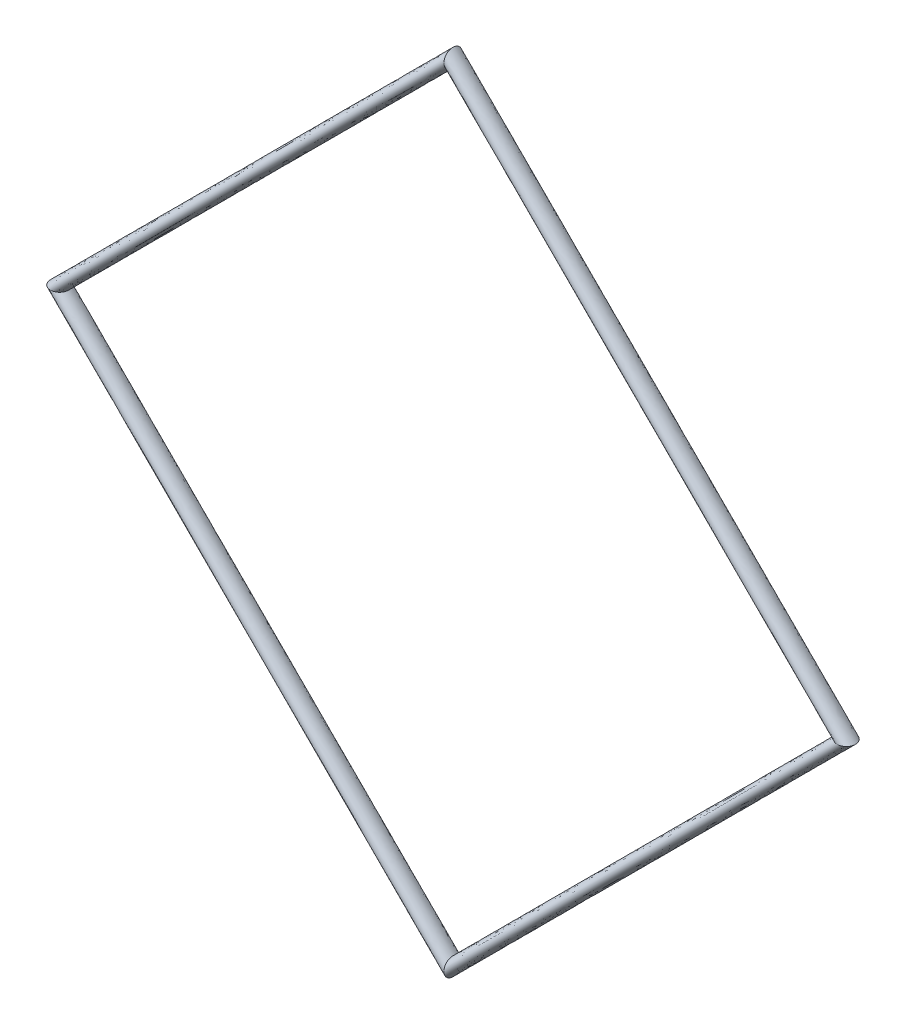
ISO-10303-21;
HEADER;
FILE_DESCRIPTION(('STEP AP214'),'2;1');
FILE_NAME('part.step','',(''),(''),'','','');
FILE_SCHEMA(('AUTOMOTIVE_DESIGN { 1 0 10303 214 1 1 1 1 }'));
ENDSEC;
DATA;
#1=APPLICATION_CONTEXT('core data for automotive mechanical design processes');
#2=APPLICATION_PROTOCOL_DEFINITION('international standard','automotive_design',2000,#1);
#3=PRODUCT_CONTEXT('',#1,'mechanical');
#4=PRODUCT('Part','Part','',(#3));
#5=PRODUCT_RELATED_PRODUCT_CATEGORY('part','',(#4));
#6=PRODUCT_DEFINITION_FORMATION('','',#4);
#7=PRODUCT_DEFINITION_CONTEXT('part definition',#1,'design');
#8=PRODUCT_DEFINITION('design','',#6,#7);
#9=PRODUCT_DEFINITION_SHAPE('','',#8);
#10=(LENGTH_UNIT() NAMED_UNIT(*) SI_UNIT(.MILLI.,.METRE.));
#11=(NAMED_UNIT(*) PLANE_ANGLE_UNIT() SI_UNIT($,.RADIAN.));
#12=(NAMED_UNIT(*) SI_UNIT($,.STERADIAN.) SOLID_ANGLE_UNIT());
#13=UNCERTAINTY_MEASURE_WITH_UNIT(LENGTH_MEASURE(1.E-05),#10,'distance_accuracy_value','');
#14=(GEOMETRIC_REPRESENTATION_CONTEXT(3) GLOBAL_UNCERTAINTY_ASSIGNED_CONTEXT((#13)) GLOBAL_UNIT_ASSIGNED_CONTEXT((#10,
#11,#12)) REPRESENTATION_CONTEXT('',''));
#15=CARTESIAN_POINT('',(0.,0.,0.));
#16=DIRECTION('',(0.,0.,1.));
#17=DIRECTION('',(1.,0.,0.));
#18=AXIS2_PLACEMENT_3D('',#15,#16,#17);
#19=CARTESIAN_POINT('',(-197.565634663521,0.,4.57199999999999));
#20=CARTESIAN_POINT('',(10.1291106781186,-207.69474534164,4.57199999999999));
#21=CARTESIAN_POINT('',(-206.709634663521,0.,4.57199999999999));
#22=CARTESIAN_POINT('',(0.985110678118545,-207.69474534164,4.57199999999999));
#23=CARTESIAN_POINT('',(-206.709634663521,0.,-4.57199999999999));
#24=CARTESIAN_POINT('',(0.985110678118545,-207.69474534164,-4.57199999999999));
#25=CARTESIAN_POINT('',(-197.565634663521,0.,-4.57199999999999));
#26=CARTESIAN_POINT('',(10.1291106781186,-207.69474534164,-4.57199999999999));
#27=CARTESIAN_POINT('',(-188.421634663521,0.,-4.57199999999999));
#28=CARTESIAN_POINT('',(19.2731106781185,-207.69474534164,-4.57199999999999));
#29=CARTESIAN_POINT('',(-188.421634663521,0.,4.57199999999999));
#30=CARTESIAN_POINT('',(19.2731106781185,-207.69474534164,4.57199999999999));
#31=CARTESIAN_POINT('',(-197.565634663521,0.,4.57199999999999));
#32=CARTESIAN_POINT('',(10.1291106781186,-207.69474534164,4.57199999999999));
#33=(BOUNDED_SURFACE() B_SPLINE_SURFACE(3,1,((#19,#20),(#21,#22),(#23,#24),(#25,#26),(#27,#28),
(#29,#30),(#31,#32)),.UNSPECIFIED.,.T.,.F.,.F.) B_SPLINE_SURFACE_WITH_KNOTS((4,3,4),(2,2),(0.,
0.5,1.),(0.,1.),.UNSPECIFIED.) GEOMETRIC_REPRESENTATION_ITEM() RATIONAL_B_SPLINE_SURFACE(((1.,
1.),(0.333333333333333,0.333333333333333),(0.333333333333333,0.333333333333333),(1.,1.),
(0.333333333333333,0.333333333333333),(0.333333333333333,0.333333333333333),(1.,1.))) REPRESENTATION_ITEM('') SURFACE());
#34=CARTESIAN_POINT('',(-197.565634663521,0.,4.57199999999999));
#35=CARTESIAN_POINT('',(-197.308823402851,0.,4.57198861185438));
#36=CARTESIAN_POINT('',(-197.051825929814,0.,4.55028959253432));
#37=CARTESIAN_POINT('',(-196.54490885607,0.,4.46402901782429));
#38=CARTESIAN_POINT('',(-196.294998151838,0.,4.39941587532972));
#39=CARTESIAN_POINT('',(-195.809671885781,0.,4.22916644072681));
#40=CARTESIAN_POINT('',(-195.574249463321,0.,4.12354974090799));
#41=CARTESIAN_POINT('',(-195.12454371449,0.,3.87431817405437));
#42=CARTESIAN_POINT('',(-194.910255149912,0.,3.73071275550514));
#43=CARTESIAN_POINT('',(-194.508802096798,0.,3.40955118564372));
#44=CARTESIAN_POINT('',(-194.321640448895,0.,3.23199148327236));
#45=CARTESIAN_POINT('',(-193.979776494639,0.,2.84796348528349));
#46=CARTESIAN_POINT('',(-193.825075462959,0.,2.64149405496222));
#47=CARTESIAN_POINT('',(-193.552535583954,0.,2.20551732061822));
#48=CARTESIAN_POINT('',(-193.43469605015,0.,1.97601044573125));
#49=CARTESIAN_POINT('',(-193.239220733011,0.,1.50047110153609));
#50=CARTESIAN_POINT('',(-193.161584868834,0.,1.25443866545861));
#51=CARTESIAN_POINT('',(-193.048720231541,0.,0.7528314375672));
#52=CARTESIAN_POINT('',(-193.013491539268,0.,0.49725662756302));
#53=CARTESIAN_POINT('',(-192.986441592481,0.,-0.016179410766656));
#54=CARTESIAN_POINT('',(-192.99462025975,0.,-0.274040634971427));
#55=CARTESIAN_POINT('',(-193.054152690448,0.,-0.784730145031884));
#56=CARTESIAN_POINT('',(-193.105506469988,0.,-1.03755842900951));
#57=CARTESIAN_POINT('',(-193.249931443096,0.,-1.53100517615395));
#58=CARTESIAN_POINT('',(-193.343002680702,0.,-1.77162362643168));
#59=CARTESIAN_POINT('',(-193.568220522987,0.,-2.23381988583276));
#60=CARTESIAN_POINT('',(-193.70036711495,0.,-2.45539770115231));
#61=CARTESIAN_POINT('',(-193.999984361591,0.,-2.87322274874834));
#62=CARTESIAN_POINT('',(-194.167455001971,0.,-3.06946999127775));
#63=CARTESIAN_POINT('',(-194.532966405638,0.,-3.43106314355837));
#64=CARTESIAN_POINT('',(-194.731007173114,0.,-3.59640904907481));
#65=CARTESIAN_POINT('',(-195.152037047459,0.,-3.89150582970298));
#66=CARTESIAN_POINT('',(-195.375026157587,0.,-4.02125670016302));
#67=CARTESIAN_POINT('',(-195.839622680133,0.,-4.24148013109416));
#68=CARTESIAN_POINT('',(-196.081230091753,0.,-4.33195269324699));
#69=CARTESIAN_POINT('',(-196.576204690132,0.,-4.47105126240243));
#70=CARTESIAN_POINT('',(-196.829571876361,0.,-4.51967727129026));
#71=CARTESIAN_POINT('',(-197.340873684917,0.,-4.5737023914721));
#72=CARTESIAN_POINT('',(-197.598808307244,0.,-4.57910150276611));
#73=CARTESIAN_POINT('',(-198.111922994352,0.,-4.54651956212838));
#74=CARTESIAN_POINT('',(-198.367103059008,0.,-4.50853850824232));
#75=CARTESIAN_POINT('',(-198.867464817605,0.,-4.39027440199325));
#76=CARTESIAN_POINT('',(-199.112646511117,0.,-4.30999134781904));
#77=CARTESIAN_POINT('',(-199.586051496469,0.,-4.10940225322151));
#78=CARTESIAN_POINT('',(-199.814274790525,0.,-3.98909621802854));
#79=CARTESIAN_POINT('',(-200.24728439519,0.,-3.71187631207898));
#80=CARTESIAN_POINT('',(-200.452070709011,0.,-3.55496244633919));
#81=CARTESIAN_POINT('',(-200.832393187623,0.,-3.20898112148864));
#82=CARTESIAN_POINT('',(-201.007929340575,0.,-3.0199136493632));
#83=CARTESIAN_POINT('',(-201.32476849093,0.,-2.61499216130598));
#84=CARTESIAN_POINT('',(-201.466071477192,0.,-2.3991381366573));
#85=CARTESIAN_POINT('',(-201.710432909948,0.,-1.94677129955894));
#86=CARTESIAN_POINT('',(-201.813491396813,0.,-1.71025850891709));
#87=CARTESIAN_POINT('',(-201.97843848717,0.,-1.22328793139402));
#88=CARTESIAN_POINT('',(-202.040327106025,0.,-0.972830149716376));
#89=CARTESIAN_POINT('',(-202.121177758557,0.,-0.46507879613651));
#90=CARTESIAN_POINT('',(-202.140139714883,0.,-0.207785211917673));
#91=CARTESIAN_POINT('',(-202.134598556385,0.,0.306332997239181));
#92=CARTESIAN_POINT('',(-202.11009552442,0.,0.563157623070265));
#93=CARTESIAN_POINT('',(-202.018319981944,0.,1.0690484386535));
#94=CARTESIAN_POINT('',(-201.951047385431,0.,1.31811461280386));
#95=CARTESIAN_POINT('',(-201.775640835647,0.,1.8014222175758));
#96=CARTESIAN_POINT('',(-201.667506121371,0.,2.03566337200547));
#97=CARTESIAN_POINT('',(-201.413449539634,0.,2.48265746562916));
#98=CARTESIAN_POINT('',(-201.267529155839,0.,2.69541124807574));
#99=CARTESIAN_POINT('',(-200.942060853246,0.,3.09338070898616));
#100=CARTESIAN_POINT('',(-200.76251645449,0.,3.27859926642845));
#101=CARTESIAN_POINT('',(-200.374828298527,0.,3.61631146368265));
#102=CARTESIAN_POINT('',(-200.166677444142,0.,3.76879695838924));
#103=CARTESIAN_POINT('',(-199.727648837001,0.,4.03671548447496));
#104=CARTESIAN_POINT('',(-199.496760280507,0.,4.15213079001559));
#105=CARTESIAN_POINT('',(-199.019064764256,0.,4.34242740100954));
#106=CARTESIAN_POINT('',(-198.772277285736,1.59126455402273E-13,4.41735729512448));
#107=CARTESIAN_POINT('',(-198.364203294503,1.03328632963321E-13,4.50458560720421));
#108=CARTESIAN_POINT('',(-198.20556835542,0.,4.52983445406876));
#109=CARTESIAN_POINT('',(-197.886524737388,0.,4.56354520869359));
#110=CARTESIAN_POINT('',(-197.726116058437,0.,4.57200711645387));
#111=CARTESIAN_POINT('',(-197.565634663521,0.,4.57199999999999));
#112=B_SPLINE_CURVE_WITH_KNOTS('',3,(#34,#35,#36,#37,#38,#39,#40,#41,#42,#43,#44,#45,#46,#47,
#48,#49,#50,#51,#52,#53,#54,#55,#56,#57,#58,#59,#60,#61,#62,#63,#64,#65,#66,#67,#68,#69,#70,#71,
#72,#73,#74,#75,#76,#77,#78,#79,#80,#81,#82,#83,#84,#85,#86,#87,#88,#89,#90,#91,#92,#93,#94,#95,
#96,#97,#98,#99,#100,#101,#102,#103,#104,#105,#106,#107,#108,#109,#110,#111),.UNSPECIFIED.,.T.,
.F.,(4,2,2,2,2,2,2,2,2,2,2,2,2,2,2,2,2,2,2,2,2,2,2,2,2,2,2,2,2,2,2,2,2,2,2,2,2,2,4),(0.,
0.769848025256944,1.54062316452426,2.31103046496558,3.08124633095741,3.85154279294848,
4.6218694974735,5.39218185520754,6.16249266399161,6.93280494126339,7.70311583050972,
8.47342700719498,9.24373899702788,10.0140507361851,10.784362163546,11.5546736964717,
12.3249853300641,13.0952969306749,13.8656084965823,14.6359200624898,15.4062316631005,
16.176543296693,16.9468548296187,17.7171662569797,18.4874779961368,19.2577899859697,
20.0281011626549,20.7984120519013,21.5687243291731,22.3390351379572,23.1093474956912,
23.8796742002162,24.6499706622073,25.4201865281991,26.1905938286404,26.9613689679077,
27.7312169931646,28.2122951384283,28.6933732836921),.UNSPECIFIED.);
#113=CARTESIAN_POINT('',(-197.565634663521,0.,4.57199999999999));
#114=VERTEX_POINT('',#113);
#115=EDGE_CURVE('E69',#114,#114,#112,.T.);
#116=CARTESIAN_POINT('',(0.,-197.565634663521,0.));
#117=DIRECTION('',(1.,0.,0.));
#118=DIRECTION('',(0.,0.,1.));
#119=AXIS2_PLACEMENT_3D('',#116,#117,#118);
#120=CIRCLE('',#119,4.57199999999999);
#121=CARTESIAN_POINT('',(0.,-197.565634663521,4.57199999999999));
#122=VERTEX_POINT('',#121);
#123=EDGE_CURVE('E41',#122,#122,#120,.T.);
#124=ORIENTED_EDGE('',*,*,#115,.F.);
#125=EDGE_LOOP('',(#124));
#126=FACE_BOUND('',#125,.T.);
#127=ORIENTED_EDGE('',*,*,#123,.F.);
#128=EDGE_LOOP('',(#127));
#129=FACE_BOUND('',#128,.T.);
#130=ADVANCED_FACE('F36',(#126,#129),#33,.T.);
#131=CARTESIAN_POINT('',(0.,-197.565634663521,4.57199999999999));
#132=CARTESIAN_POINT('',(207.69474534164,10.1291106781187,4.57199999999999));
#133=CARTESIAN_POINT('',(0.,-206.709634663521,4.57199999999999));
#134=CARTESIAN_POINT('',(207.69474534164,0.985110678118669,4.57199999999999));
#135=CARTESIAN_POINT('',(0.,-206.709634663521,-4.57199999999999));
#136=CARTESIAN_POINT('',(207.69474534164,0.985110678118669,-4.57199999999999));
#137=CARTESIAN_POINT('',(0.,-197.565634663521,-4.57199999999999));
#138=CARTESIAN_POINT('',(207.69474534164,10.1291106781187,-4.57199999999999));
#139=CARTESIAN_POINT('',(0.,-188.421634663521,-4.57199999999999));
#140=CARTESIAN_POINT('',(207.69474534164,19.2731106781186,-4.57199999999999));
#141=CARTESIAN_POINT('',(0.,-188.421634663521,4.57199999999999));
#142=CARTESIAN_POINT('',(207.69474534164,19.2731106781186,4.57199999999999));
#143=CARTESIAN_POINT('',(0.,-197.565634663521,4.57199999999999));
#144=CARTESIAN_POINT('',(207.69474534164,10.1291106781187,4.57199999999999));
#145=(BOUNDED_SURFACE() B_SPLINE_SURFACE(3,1,((#131,#132),(#133,#134),(#135,#136),(#137,#138),
(#139,#140),(#141,#142),(#143,#144)),.UNSPECIFIED.,.T.,.F.,.F.) B_SPLINE_SURFACE_WITH_KNOTS((4,
3,4),(2,2),(0.,0.5,1.),(0.,1.),
.UNSPECIFIED.) GEOMETRIC_REPRESENTATION_ITEM() RATIONAL_B_SPLINE_SURFACE(((1.,1.),
(0.333333333333333,0.333333333333333),(0.333333333333333,0.333333333333333),(1.,1.),
(0.333333333333333,0.333333333333333),(0.333333333333333,0.333333333333333),(1.,1.))) REPRESENTATION_ITEM('') SURFACE());
#146=CARTESIAN_POINT('',(197.565634663521,0.,0.));
#147=DIRECTION('',(0.,1.,0.));
#148=DIRECTION('',(0.,0.,1.));
#149=AXIS2_PLACEMENT_3D('',#146,#147,#148);
#150=CIRCLE('',#149,4.57199999999999);
#151=CARTESIAN_POINT('',(197.565634663521,0.,4.57199999999999));
#152=VERTEX_POINT('',#151);
#153=EDGE_CURVE('E152',#152,#152,#150,.T.);
#154=ORIENTED_EDGE('',*,*,#123,.T.);
#155=EDGE_LOOP('',(#154));
#156=FACE_BOUND('',#155,.T.);
#157=ORIENTED_EDGE('',*,*,#153,.F.);
#158=EDGE_LOOP('',(#157));
#159=FACE_BOUND('',#158,.T.);
#160=ADVANCED_FACE('F162',(#156,#159),#145,.T.);
#161=CARTESIAN_POINT('',(0.,197.565634663521,4.57199999999999));
#162=CARTESIAN_POINT('',(-207.69474534164,-10.1291106781187,4.57199999999999));
#163=CARTESIAN_POINT('',(0.,206.709634663521,4.57199999999999));
#164=CARTESIAN_POINT('',(-207.69474534164,-0.985110678118669,4.57199999999999));
#165=CARTESIAN_POINT('',(0.,206.709634663521,-4.57199999999999));
#166=CARTESIAN_POINT('',(-207.69474534164,-0.985110678118669,-4.57199999999999));
#167=CARTESIAN_POINT('',(0.,197.565634663521,-4.57199999999999));
#168=CARTESIAN_POINT('',(-207.69474534164,-10.1291106781187,-4.57199999999999));
#169=CARTESIAN_POINT('',(0.,188.421634663521,-4.57199999999999));
#170=CARTESIAN_POINT('',(-207.69474534164,-19.2731106781186,-4.57199999999999));
#171=CARTESIAN_POINT('',(0.,188.421634663521,4.57199999999999));
#172=CARTESIAN_POINT('',(-207.69474534164,-19.2731106781186,4.57199999999999));
#173=CARTESIAN_POINT('',(0.,197.565634663521,4.57199999999999));
#174=CARTESIAN_POINT('',(-207.69474534164,-10.1291106781187,4.57199999999999));
#175=(BOUNDED_SURFACE() B_SPLINE_SURFACE(3,1,((#161,#162),(#163,#164),(#165,#166),(#167,#168),
(#169,#170),(#171,#172),(#173,#174)),.UNSPECIFIED.,.T.,.F.,.F.) B_SPLINE_SURFACE_WITH_KNOTS((4,
3,4),(2,2),(0.,0.5,1.),(0.,1.),
.UNSPECIFIED.) GEOMETRIC_REPRESENTATION_ITEM() RATIONAL_B_SPLINE_SURFACE(((1.,1.),
(0.333333333333333,0.333333333333333),(0.333333333333333,0.333333333333333),(1.,1.),
(0.333333333333333,0.333333333333333),(0.333333333333333,0.333333333333333),(1.,1.))) REPRESENTATION_ITEM('') SURFACE());
#176=CARTESIAN_POINT('',(0.,197.565634663521,4.57199999999999));
#177=CARTESIAN_POINT('',(0.,197.308823402851,4.57198861185439));
#178=CARTESIAN_POINT('',(0.,197.051825929814,4.55028959253432));
#179=CARTESIAN_POINT('',(0.,196.54490885607,4.46402901782429));
#180=CARTESIAN_POINT('',(0.,196.294998151838,4.39941587532971));
#181=CARTESIAN_POINT('',(0.,195.80967188578,4.22916644072678));
#182=CARTESIAN_POINT('',(0.,195.574249463321,4.12354974090796));
#183=CARTESIAN_POINT('',(0.,195.12454371449,3.87431817405434));
#184=CARTESIAN_POINT('',(0.,194.910255149912,3.73071275550512));
#185=CARTESIAN_POINT('',(0.,194.508802096798,3.40955118564368));
#186=CARTESIAN_POINT('',(0.,194.321640448895,3.2319914832723));
#187=CARTESIAN_POINT('',(0.,193.979776494639,2.84796348528341));
#188=CARTESIAN_POINT('',(0.,193.825075462959,2.64149405496216));
#189=CARTESIAN_POINT('',(0.,193.552535583954,2.20551732061816));
#190=CARTESIAN_POINT('',(0.,193.43469605015,1.97601044573118));
#191=CARTESIAN_POINT('',(0.,193.239220733011,1.50047110153602));
#192=CARTESIAN_POINT('',(0.,193.161584868834,1.25443866545855));
#193=CARTESIAN_POINT('',(0.,193.048720231541,0.752831437567148));
#194=CARTESIAN_POINT('',(0.,193.013491539268,0.497256627562961));
#195=CARTESIAN_POINT('',(0.,192.986441592481,-0.0161794107667197));
#196=CARTESIAN_POINT('',(0.,192.99462025975,-0.274040634971487));
#197=CARTESIAN_POINT('',(0.,193.054152690448,-0.784730145031953));
#198=CARTESIAN_POINT('',(0.,193.105506469988,-1.03755842900959));
#199=CARTESIAN_POINT('',(0.,193.249931443096,-1.53100517615403));
#200=CARTESIAN_POINT('',(0.,193.343002680702,-1.77162362643175));
#201=CARTESIAN_POINT('',(0.,193.568220522987,-2.2338198858328));
#202=CARTESIAN_POINT('',(0.,193.70036711495,-2.45539770115234));
#203=CARTESIAN_POINT('',(0.,193.999984361591,-2.87322274874838));
#204=CARTESIAN_POINT('',(0.,194.167455001971,-3.06946999127781));
#205=CARTESIAN_POINT('',(0.,194.532966405638,-3.43106314355844));
#206=CARTESIAN_POINT('',(0.,194.731007173114,-3.59640904907486));
#207=CARTESIAN_POINT('',(0.,195.152037047459,-3.891505829703));
#208=CARTESIAN_POINT('',(0.,195.375026157587,-4.02125670016305));
#209=CARTESIAN_POINT('',(0.,195.839622680133,-4.24148013109419));
#210=CARTESIAN_POINT('',(0.,196.081230091753,-4.33195269324702));
#211=CARTESIAN_POINT('',(0.,196.576204690132,-4.47105126240246));
#212=CARTESIAN_POINT('',(0.,196.829571876361,-4.51967727129028));
#213=CARTESIAN_POINT('',(0.,197.340873684917,-4.57370239147211));
#214=CARTESIAN_POINT('',(0.,197.598808307244,-4.5791015027661));
#215=CARTESIAN_POINT('',(0.,198.111922994352,-4.54651956212837));
#216=CARTESIAN_POINT('',(0.,198.367103059008,-4.50853850824233));
#217=CARTESIAN_POINT('',(0.,198.867464817605,-4.39027440199326));
#218=CARTESIAN_POINT('',(0.,199.112646511117,-4.30999134781904));
#219=CARTESIAN_POINT('',(0.,199.586051496469,-4.10940225322147));
#220=CARTESIAN_POINT('',(0.,199.814274790525,-3.98909621802846));
#221=CARTESIAN_POINT('',(0.,200.24728439519,-3.71187631207891));
#222=CARTESIAN_POINT('',(0.,200.452070709011,-3.55496244633916));
#223=CARTESIAN_POINT('',(0.,200.832393187623,-3.20898112148866));
#224=CARTESIAN_POINT('',(0.,201.007929340575,-3.01991364936324));
#225=CARTESIAN_POINT('',(0.,201.32476849093,-2.61499216130601));
#226=CARTESIAN_POINT('',(0.,201.466071477192,-2.3991381366573));
#227=CARTESIAN_POINT('',(0.,201.710432909948,-1.9467712995589));
#228=CARTESIAN_POINT('',(0.,201.813491396813,-1.71025850891702));
#229=CARTESIAN_POINT('',(0.,201.97843848717,-1.22328793139394));
#230=CARTESIAN_POINT('',(0.,202.040327106025,-0.972830149716283));
#231=CARTESIAN_POINT('',(0.,202.121177758557,-0.465078796136427));
#232=CARTESIAN_POINT('',(0.,202.140139714883,-0.207785211917606));
#233=CARTESIAN_POINT('',(0.,202.134598556385,0.306332997239242));
#234=CARTESIAN_POINT('',(0.,202.11009552442,0.563157623070337));
#235=CARTESIAN_POINT('',(0.,202.018319981944,1.06904843865358));
#236=CARTESIAN_POINT('',(0.,201.951047385431,1.31811461280394));
#237=CARTESIAN_POINT('',(0.,201.775640835647,1.80142221757587));
#238=CARTESIAN_POINT('',(0.,201.667506121371,2.03566337200553));
#239=CARTESIAN_POINT('',(0.,201.413449539634,2.4826574656292));
#240=CARTESIAN_POINT('',(0.,201.267529155839,2.69541124807578));
#241=CARTESIAN_POINT('',(0.,200.942060853246,3.09338070898623));
#242=CARTESIAN_POINT('',(0.,200.76251645449,3.27859926642854));
#243=CARTESIAN_POINT('',(0.,200.374828298527,3.61631146368273));
#244=CARTESIAN_POINT('',(0.,200.166677444142,3.76879695838927));
#245=CARTESIAN_POINT('',(0.,199.727648837001,4.03671548447496));
#246=CARTESIAN_POINT('',(0.,199.496760280507,4.1521307900156));
#247=CARTESIAN_POINT('',(0.,199.019064764256,4.34242740100956));
#248=CARTESIAN_POINT('',(1.55852489782016E-13,198.772277285735,4.41735729512451));
#249=CARTESIAN_POINT('',(1.07078457074383E-13,198.364203294503,4.50458560720423));
#250=CARTESIAN_POINT('',(0.,198.20556835542,4.52983445406877));
#251=CARTESIAN_POINT('',(0.,197.886524737388,4.56354520869359));
#252=CARTESIAN_POINT('',(0.,197.726116058437,4.57200711645387));
#253=CARTESIAN_POINT('',(0.,197.565634663521,4.57199999999999));
#254=B_SPLINE_CURVE_WITH_KNOTS('',3,(#176,#177,#178,#179,#180,#181,#182,#183,#184,#185,#186,
#187,#188,#189,#190,#191,#192,#193,#194,#195,#196,#197,#198,#199,#200,#201,#202,#203,#204,#205,
#206,#207,#208,#209,#210,#211,#212,#213,#214,#215,#216,#217,#218,#219,#220,#221,#222,#223,#224,
#225,#226,#227,#228,#229,#230,#231,#232,#233,#234,#235,#236,#237,#238,#239,#240,#241,#242,#243,
#244,#245,#246,#247,#248,#249,#250,#251,#252,#253),.UNSPECIFIED.,.T.,.F.,(4,2,2,2,2,2,2,2,2,2,2,
2,2,2,2,2,2,2,2,2,2,2,2,2,2,2,2,2,2,2,2,2,2,2,2,2,2,2,4),(0.,0.769848025256943,1.54062316452433,
2.31103046496564,3.08124633095745,3.85154279294855,4.6218694974736,5.39218185520762,
6.16249266399169,6.93280494126347,7.70311583050981,8.47342700719507,9.24373899702795,
10.0140507361851,10.7843621635461,11.5546736964718,12.3249853300642,13.0952969306749,
13.8656084965824,14.6359200624898,15.4062316631005,16.176543296693,16.9468548296188,
17.7171662569797,18.4874779961368,19.2577899859697,20.028101162655,20.7984120519014,
21.5687243291732,22.3390351379572,23.1093474956913,23.8796742002163,24.6499706622073,
25.4201865281992,26.1905938286405,26.9613689679078,27.7312169931647,28.2122951384284,
28.6933732836921),.UNSPECIFIED.);
#255=CARTESIAN_POINT('',(0.,197.565634663521,4.57199999999999));
#256=VERTEX_POINT('',#255);
#257=EDGE_CURVE('E147',#256,#256,#254,.T.);
#258=ORIENTED_EDGE('',*,*,#257,.F.);
#259=EDGE_LOOP('',(#258));
#260=FACE_BOUND('',#259,.T.);
#261=ORIENTED_EDGE('',*,*,#115,.T.);
#262=EDGE_LOOP('',(#261));
#263=FACE_BOUND('',#262,.T.);
#264=ADVANCED_FACE('F156',(#260,#263),#175,.T.);
#265=CARTESIAN_POINT('',(197.565634663521,0.,4.57199999999999));
#266=CARTESIAN_POINT('',(-10.1291106781187,207.69474534164,4.57199999999999));
#267=CARTESIAN_POINT('',(206.709634663521,0.,4.57199999999999));
#268=CARTESIAN_POINT('',(-0.985110678118669,207.69474534164,4.57199999999999));
#269=CARTESIAN_POINT('',(206.709634663521,0.,-4.57199999999999));
#270=CARTESIAN_POINT('',(-0.985110678118669,207.69474534164,-4.57199999999999));
#271=CARTESIAN_POINT('',(197.565634663521,0.,-4.57199999999999));
#272=CARTESIAN_POINT('',(-10.1291106781187,207.69474534164,-4.57199999999999));
#273=CARTESIAN_POINT('',(188.421634663521,0.,-4.57199999999999));
#274=CARTESIAN_POINT('',(-19.2731106781186,207.69474534164,-4.57199999999999));
#275=CARTESIAN_POINT('',(188.421634663521,0.,4.57199999999999));
#276=CARTESIAN_POINT('',(-19.2731106781186,207.69474534164,4.57199999999999));
#277=CARTESIAN_POINT('',(197.565634663521,0.,4.57199999999999));
#278=CARTESIAN_POINT('',(-10.1291106781187,207.69474534164,4.57199999999999));
#279=(BOUNDED_SURFACE() B_SPLINE_SURFACE(3,1,((#265,#266),(#267,#268),(#269,#270),(#271,#272),
(#273,#274),(#275,#276),(#277,#278)),.UNSPECIFIED.,.T.,.F.,.F.) B_SPLINE_SURFACE_WITH_KNOTS((4,
3,4),(2,2),(0.,0.5,1.),(0.,1.),
.UNSPECIFIED.) GEOMETRIC_REPRESENTATION_ITEM() RATIONAL_B_SPLINE_SURFACE(((1.,1.),
(0.333333333333333,0.333333333333333),(0.333333333333333,0.333333333333333),(1.,1.),
(0.333333333333333,0.333333333333333),(0.333333333333333,0.333333333333333),(1.,1.))) REPRESENTATION_ITEM('') SURFACE());
#280=ORIENTED_EDGE('',*,*,#153,.T.);
#281=EDGE_LOOP('',(#280));
#282=FACE_BOUND('',#281,.T.);
#283=ORIENTED_EDGE('',*,*,#257,.T.);
#284=EDGE_LOOP('',(#283));
#285=FACE_BOUND('',#284,.T.);
#286=ADVANCED_FACE('F141',(#282,#285),#279,.T.);
#287=CLOSED_SHELL('',(#130,#160,#264,#286));
#288=CARTESIAN_POINT('',(-197.565634663521,0.,4.31799999999999));
#289=CARTESIAN_POINT('',(9.57031067811856,-207.13594534164,4.31799999999999));
#290=CARTESIAN_POINT('',(-188.929634663521,0.,4.31799999999999));
#291=CARTESIAN_POINT('',(18.2063106781186,-207.13594534164,4.31799999999999));
#292=CARTESIAN_POINT('',(-188.929634663521,0.,-4.31799999999999));
#293=CARTESIAN_POINT('',(18.2063106781186,-207.13594534164,-4.31799999999999));
#294=CARTESIAN_POINT('',(-197.565634663521,0.,-4.31799999999999));
#295=CARTESIAN_POINT('',(9.57031067811856,-207.13594534164,-4.31799999999999));
#296=CARTESIAN_POINT('',(-206.201634663521,0.,-4.31799999999999));
#297=CARTESIAN_POINT('',(0.934310678118597,-207.13594534164,-4.31799999999999));
#298=CARTESIAN_POINT('',(-206.201634663521,0.,4.31799999999999));
#299=CARTESIAN_POINT('',(0.934310678118597,-207.13594534164,4.31799999999999));
#300=CARTESIAN_POINT('',(-197.565634663521,0.,4.31799999999999));
#301=CARTESIAN_POINT('',(9.57031067811856,-207.13594534164,4.31799999999999));
#302=(BOUNDED_SURFACE() B_SPLINE_SURFACE(3,1,((#288,#289),(#290,#291),(#292,#293),(#294,#295),
(#296,#297),(#298,#299),(#300,#301)),.UNSPECIFIED.,.T.,.F.,.F.) B_SPLINE_SURFACE_WITH_KNOTS((4,
3,4),(2,2),(0.,0.5,1.),(0.,1.),
.UNSPECIFIED.) GEOMETRIC_REPRESENTATION_ITEM() RATIONAL_B_SPLINE_SURFACE(((1.,1.),
(0.333333333333333,0.333333333333333),(0.333333333333333,0.333333333333333),(1.,1.),
(0.333333333333333,0.333333333333333),(0.333333333333333,0.333333333333333),(1.,1.))) REPRESENTATION_ITEM('') SURFACE());
#303=CARTESIAN_POINT('',(-197.565634663521,0.,4.31799999999999));
#304=CARTESIAN_POINT('',(-197.808178631933,0.,4.31798924452914));
#305=CARTESIAN_POINT('',(-198.050898467578,0.,4.29749572628241));
#306=CARTESIAN_POINT('',(-198.52965348167,0.,4.21602740572295));
#307=CARTESIAN_POINT('',(-198.765680257889,0.,4.15500388225585));
#308=CARTESIAN_POINT('',(-199.22404395361,0.,3.99421274957532));
#309=CARTESIAN_POINT('',(-199.446387352599,0.,3.89446364419087));
#310=CARTESIAN_POINT('',(-199.871109448717,0.,3.65907827549578));
#311=CARTESIAN_POINT('',(-200.073493093042,0.,3.52345093575483));
#312=CARTESIAN_POINT('',(-200.45264319876,0.,3.22013167533015));
#313=CARTESIAN_POINT('',(-200.629406977335,0.,3.0524364008683));
#314=CARTESIAN_POINT('',(-200.952278489688,0.,2.6897432916566));
#315=CARTESIAN_POINT('',(-201.098385019608,0.,2.49474438524209));
#316=CARTESIAN_POINT('',(-201.355783794224,0.,2.08298858058389));
#317=CARTESIAN_POINT('',(-201.467076687261,0.,1.86623208763508));
#318=CARTESIAN_POINT('',(-201.651692264559,0.,1.41711159589518));
#319=CARTESIAN_POINT('',(-201.725015025171,0.,1.18474762848866));
#320=CARTESIAN_POINT('',(-201.831609404836,0.,0.711007468813428));
#321=CARTESIAN_POINT('',(-201.864880947538,0.,0.469631259365036));
#322=CARTESIAN_POINT('',(-201.890428119504,0.,-0.0152805546129855));
#323=CARTESIAN_POINT('',(-201.882703822639,0.,-0.258816155250818));
#324=CARTESIAN_POINT('',(-201.826478749202,0.,-0.741134025863487));
#325=CARTESIAN_POINT('',(-201.777977957414,0.,-0.979916294064599));
#326=CARTESIAN_POINT('',(-201.641576593923,0.,-1.44594933303435));
#327=CARTESIAN_POINT('',(-201.553675980628,0.,-1.67320009162997));
#328=CARTESIAN_POINT('',(-201.340970240693,0.,-2.10971878106431));
#329=CARTESIAN_POINT('',(-201.216165126061,0.,-2.31898671775499));
#330=CARTESIAN_POINT('',(-200.933193282011,0.,-2.71359926270682));
#331=CARTESIAN_POINT('',(-200.775026566097,0.,-2.89894388065128));
#332=CARTESIAN_POINT('',(-200.429821351523,0.,-3.24044852447186));
#333=CARTESIAN_POINT('',(-200.242782848906,0.,-3.39660854634846));
#334=CARTESIAN_POINT('',(-199.845143523136,0.,-3.67531106138613));
#335=CARTESIAN_POINT('',(-199.634542696904,0.,-3.79785355015396));
#336=CARTESIAN_POINT('',(-199.195757092277,0.,-4.00584234603339));
#337=CARTESIAN_POINT('',(-198.967572314636,0.,-4.0912886547333));
#338=CARTESIAN_POINT('',(-198.500096305056,0.,-4.22265952560233));
#339=CARTESIAN_POINT('',(-198.260805073618,0.,-4.26858408955193));
#340=CARTESIAN_POINT('',(-197.777908921092,0.,-4.31960781416809));
#341=CARTESIAN_POINT('',(-197.534304000005,0.,-4.32470697483465));
#342=CARTESIAN_POINT('',(-197.049695684403,0.,-4.29393514201012));
#343=CARTESIAN_POINT('',(-196.808692290006,0.,-4.25806414667329));
#344=CARTESIAN_POINT('',(-196.336128406887,0.,-4.14637026854916));
#345=CARTESIAN_POINT('',(-196.10456791857,0.,-4.07054738405127));
#346=CARTESIAN_POINT('',(-195.657463210182,0.,-3.88110212804247));
#347=CARTESIAN_POINT('',(-195.441918988018,0.,-3.76747976147133));
#348=CARTESIAN_POINT('',(-195.032965472501,0.,-3.50566096140784));
#349=CARTESIAN_POINT('',(-194.839556176115,0.,-3.3574645326536));
#350=CARTESIAN_POINT('',(-194.480362724092,0.,-3.03070439251699));
#351=CARTESIAN_POINT('',(-194.314578579637,0.,-2.852140668843));
#352=CARTESIAN_POINT('',(-194.015341604302,0.,-2.46971481901118));
#353=CARTESIAN_POINT('',(-193.881888783944,0.,-2.26585268462074));
#354=CARTESIAN_POINT('',(-193.651102986341,0.,-1.83861733847226));
#355=CARTESIAN_POINT('',(-193.553769970969,0.,-1.6152441473105));
#356=CARTESIAN_POINT('',(-193.397986607853,0.,-1.15532749076094));
#357=CARTESIAN_POINT('',(-193.339536245601,0.,-0.918784030287618));
#358=CARTESIAN_POINT('',(-193.263177295988,0.,-0.439241085239982));
#359=CARTESIAN_POINT('',(-193.24526878168,0.,-0.196241589033312));
#360=CARTESIAN_POINT('',(-193.250502098039,0.,0.289314497392596));
#361=CARTESIAN_POINT('',(-193.27364385045,0.,0.531871088455285));
#362=CARTESIAN_POINT('',(-193.360320751678,0.,1.00965685872834));
#363=CARTESIAN_POINT('',(-193.423855981718,0.,1.24488602320368));
#364=CARTESIAN_POINT('',(-193.58951772318,0.,1.70134320548829));
#365=CARTESIAN_POINT('',(-193.69164495333,0.,1.92257096244964));
#366=CARTESIAN_POINT('',(-193.931587280526,0.,2.344732050872));
#367=CARTESIAN_POINT('',(-194.069400976333,0.,2.5456661787382));
#368=CARTESIAN_POINT('',(-194.376787706559,0.,2.92152622515362));
#369=CARTESIAN_POINT('',(-194.546357416496,0.,3.09645486273803));
#370=CARTESIAN_POINT('',(-194.912507341572,0.,3.41540527125588));
#371=CARTESIAN_POINT('',(-195.109094259602,0.,3.55941934958985));
#372=CARTESIAN_POINT('',(-195.523732388569,0.,3.81245351311522));
#373=CARTESIAN_POINT('',(-195.741793803035,0.,3.92145685723693));
#374=CARTESIAN_POINT('',(-196.192950679494,0.,4.10118143428679));
#375=CARTESIAN_POINT('',(-196.426027742541,-1.44765860456312E-13,4.17194855650646));
#376=CARTESIAN_POINT('',(-196.811430956484,-1.03782958332038E-13,4.25433085124843));
#377=CARTESIAN_POINT('',(-196.961252843395,0.,4.27817698439828));
#378=CARTESIAN_POINT('',(-197.262571815981,0.,4.31001491932172));
#379=CARTESIAN_POINT('',(-197.414068901656,0.,4.31800672109532));
#380=CARTESIAN_POINT('',(-197.565634663521,0.,4.31799999999999));
#381=B_SPLINE_CURVE_WITH_KNOTS('',3,(#303,#304,#305,#306,#307,#308,#309,#310,#311,#312,#313,
#314,#315,#316,#317,#318,#319,#320,#321,#322,#323,#324,#325,#326,#327,#328,#329,#330,#331,#332,
#333,#334,#335,#336,#337,#338,#339,#340,#341,#342,#343,#344,#345,#346,#347,#348,#349,#350,#351,
#352,#353,#354,#355,#356,#357,#358,#359,#360,#361,#362,#363,#364,#365,#366,#367,#368,#369,#370,
#371,#372,#373,#374,#375,#376,#377,#378,#379,#380),.UNSPECIFIED.,.T.,.F.,(4,2,2,2,2,2,2,2,2,2,2,
2,2,2,2,2,2,2,2,2,2,2,2,2,2,2,2,2,2,2,2,2,2,2,2,2,2,2,4),(0.,0.727078690520431,1.45503298871736,
2.1826398835786,2.91006597923755,3.63756819334021,4.36509896983605,5.09261619658489,
5.82013196043654,6.54764911119322,7.27516495103698,8.00268106235085,8.73019794163749,
9.45771458417481,10.1852309322379,10.9127473800011,11.6402639228383,12.3677804345263,
13.0952969134389,13.8228133923515,14.5503299040394,15.2778464468768,16.00536289464,
16.7328792427031,17.4603958852404,18.187912764527,18.9154288758408,19.6429447156846,
20.3704618664413,21.0979776302929,21.8254948570417,22.5530256335375,23.2805278476402,
24.0079539432992,24.7355608381604,25.4635151363573,26.1905938268777,26.6449454085156,
27.0992969901536),.UNSPECIFIED.);
#382=CARTESIAN_POINT('',(-197.565634663521,0.,4.31799999999999));
#383=VERTEX_POINT('',#382);
#384=EDGE_CURVE('E82',#383,#383,#381,.T.);
#385=CARTESIAN_POINT('',(0.,-197.565634663521,0.));
#386=DIRECTION('',(1.,0.,0.));
#387=DIRECTION('',(0.,0.,1.));
#388=AXIS2_PLACEMENT_3D('',#385,#386,#387);
#389=CIRCLE('',#388,4.31799999999999);
#390=CARTESIAN_POINT('',(0.,-197.565634663521,4.31799999999999));
#391=VERTEX_POINT('',#390);
#392=EDGE_CURVE('E54',#391,#391,#389,.F.);
#393=ORIENTED_EDGE('',*,*,#384,.F.);
#394=EDGE_LOOP('',(#393));
#395=FACE_BOUND('',#394,.T.);
#396=ORIENTED_EDGE('',*,*,#392,.F.);
#397=EDGE_LOOP('',(#396));
#398=FACE_BOUND('',#397,.T.);
#399=ADVANCED_FACE('F123',(#395,#398),#302,.T.);
#400=CARTESIAN_POINT('',(0.,-197.565634663521,4.31799999999999));
#401=CARTESIAN_POINT('',(207.13594534164,9.57031067811861,4.31799999999999));
#402=CARTESIAN_POINT('',(0.,-188.929634663521,4.31799999999999));
#403=CARTESIAN_POINT('',(207.13594534164,18.2063106781186,4.31799999999999));
#404=CARTESIAN_POINT('',(0.,-188.929634663521,-4.31799999999999));
#405=CARTESIAN_POINT('',(207.13594534164,18.2063106781186,-4.31799999999999));
#406=CARTESIAN_POINT('',(0.,-197.565634663521,-4.31799999999999));
#407=CARTESIAN_POINT('',(207.13594534164,9.57031067811861,-4.31799999999999));
#408=CARTESIAN_POINT('',(0.,-206.201634663521,-4.31799999999999));
#409=CARTESIAN_POINT('',(207.13594534164,0.934310678118638,-4.31799999999999));
#410=CARTESIAN_POINT('',(0.,-206.201634663521,4.31799999999999));
#411=CARTESIAN_POINT('',(207.13594534164,0.934310678118638,4.31799999999999));
#412=CARTESIAN_POINT('',(0.,-197.565634663521,4.31799999999999));
#413=CARTESIAN_POINT('',(207.13594534164,9.57031067811861,4.31799999999999));
#414=(BOUNDED_SURFACE() B_SPLINE_SURFACE(3,1,((#400,#401),(#402,#403),(#404,#405),(#406,#407),
(#408,#409),(#410,#411),(#412,#413)),.UNSPECIFIED.,.T.,.F.,.F.) B_SPLINE_SURFACE_WITH_KNOTS((4,
3,4),(2,2),(0.,0.5,1.),(0.,1.),
.UNSPECIFIED.) GEOMETRIC_REPRESENTATION_ITEM() RATIONAL_B_SPLINE_SURFACE(((1.,1.),
(0.333333333333333,0.333333333333333),(0.333333333333333,0.333333333333333),(1.,1.),
(0.333333333333333,0.333333333333333),(0.333333333333333,0.333333333333333),(1.,1.))) REPRESENTATION_ITEM('') SURFACE());
#415=CARTESIAN_POINT('',(197.565634663521,0.,0.));
#416=DIRECTION('',(0.,1.,0.));
#417=DIRECTION('',(0.,0.,1.));
#418=AXIS2_PLACEMENT_3D('',#415,#416,#417);
#419=CIRCLE('',#418,4.31799999999999);
#420=CARTESIAN_POINT('',(197.565634663521,0.,4.31799999999999));
#421=VERTEX_POINT('',#420);
#422=EDGE_CURVE('E47',#421,#421,#419,.F.);
#423=ORIENTED_EDGE('',*,*,#392,.T.);
#424=EDGE_LOOP('',(#423));
#425=FACE_BOUND('',#424,.T.);
#426=ORIENTED_EDGE('',*,*,#422,.F.);
#427=EDGE_LOOP('',(#426));
#428=FACE_BOUND('',#427,.T.);
#429=ADVANCED_FACE('F112',(#425,#428),#414,.T.);
#430=CARTESIAN_POINT('',(0.,197.565634663521,4.31799999999999));
#431=CARTESIAN_POINT('',(-207.13594534164,-9.57031067811864,4.31799999999999));
#432=CARTESIAN_POINT('',(0.,188.929634663521,4.31799999999999));
#433=CARTESIAN_POINT('',(-207.13594534164,-18.2063106781186,4.31799999999999));
#434=CARTESIAN_POINT('',(0.,188.929634663521,-4.31799999999999));
#435=CARTESIAN_POINT('',(-207.13594534164,-18.2063106781186,-4.31799999999999));
#436=CARTESIAN_POINT('',(0.,197.565634663521,-4.31799999999999));
#437=CARTESIAN_POINT('',(-207.13594534164,-9.57031067811864,-4.31799999999999));
#438=CARTESIAN_POINT('',(0.,206.201634663521,-4.31799999999999));
#439=CARTESIAN_POINT('',(-207.13594534164,-0.93431067811868,-4.31799999999999));
#440=CARTESIAN_POINT('',(0.,206.201634663521,4.31799999999999));
#441=CARTESIAN_POINT('',(-207.13594534164,-0.93431067811868,4.31799999999999));
#442=CARTESIAN_POINT('',(0.,197.565634663521,4.31799999999999));
#443=CARTESIAN_POINT('',(-207.13594534164,-9.57031067811864,4.31799999999999));
#444=(BOUNDED_SURFACE() B_SPLINE_SURFACE(3,1,((#430,#431),(#432,#433),(#434,#435),(#436,#437),
(#438,#439),(#440,#441),(#442,#443)),.UNSPECIFIED.,.T.,.F.,.F.) B_SPLINE_SURFACE_WITH_KNOTS((4,
3,4),(2,2),(0.,0.5,1.),(0.,1.),
.UNSPECIFIED.) GEOMETRIC_REPRESENTATION_ITEM() RATIONAL_B_SPLINE_SURFACE(((1.,1.),
(0.333333333333333,0.333333333333333),(0.333333333333333,0.333333333333333),(1.,1.),
(0.333333333333333,0.333333333333333),(0.333333333333333,0.333333333333333),(1.,1.))) REPRESENTATION_ITEM('') SURFACE());
#445=CARTESIAN_POINT('',(0.,197.565634663521,4.31799999999999));
#446=CARTESIAN_POINT('',(0.,197.808178631933,4.31798924452914));
#447=CARTESIAN_POINT('',(0.,198.050898467578,4.2974957262824));
#448=CARTESIAN_POINT('',(0.,198.52965348167,4.21602740572293));
#449=CARTESIAN_POINT('',(0.,198.765680257889,4.15500388225583));
#450=CARTESIAN_POINT('',(0.,199.22404395361,3.9942127495753));
#451=CARTESIAN_POINT('',(0.,199.446387352599,3.89446364419086));
#452=CARTESIAN_POINT('',(0.,199.871109448718,3.65907827549577));
#453=CARTESIAN_POINT('',(0.,200.073493093042,3.52345093575483));
#454=CARTESIAN_POINT('',(0.,200.45264319876,3.22013167533015));
#455=CARTESIAN_POINT('',(0.,200.629406977335,3.05243640086831));
#456=CARTESIAN_POINT('',(0.,200.952278489688,2.68974329165662));
#457=CARTESIAN_POINT('',(0.,201.098385019608,2.49474438524212));
#458=CARTESIAN_POINT('',(0.,201.355783794224,2.08298858058394));
#459=CARTESIAN_POINT('',(0.,201.467076687261,1.86623208763512));
#460=CARTESIAN_POINT('',(0.,201.651692264559,1.41711159589523));
#461=CARTESIAN_POINT('',(0.,201.725015025171,1.18474762848872));
#462=CARTESIAN_POINT('',(0.,201.831609404836,0.711007468813484));
#463=CARTESIAN_POINT('',(0.,201.864880947538,0.469631259365082));
#464=CARTESIAN_POINT('',(0.,201.890428119504,-0.015280554612963));
#465=CARTESIAN_POINT('',(0.,201.882703822639,-0.25881615525081));
#466=CARTESIAN_POINT('',(0.,201.826478749202,-0.741134025863485));
#467=CARTESIAN_POINT('',(0.,201.777977957414,-0.979916294064591));
#468=CARTESIAN_POINT('',(0.,201.641576593923,-1.44594933303435));
#469=CARTESIAN_POINT('',(0.,201.553675980628,-1.67320009162998));
#470=CARTESIAN_POINT('',(0.,201.340970240693,-2.10971878106431));
#471=CARTESIAN_POINT('',(0.,201.216165126061,-2.31898671775498));
#472=CARTESIAN_POINT('',(0.,200.933193282011,-2.71359926270678));
#473=CARTESIAN_POINT('',(0.,200.775026566097,-2.89894388065125));
#474=CARTESIAN_POINT('',(0.,200.429821351523,-3.24044852447185));
#475=CARTESIAN_POINT('',(0.,200.242782848906,-3.39660854634848));
#476=CARTESIAN_POINT('',(0.,199.845143523136,-3.67531106138618));
#477=CARTESIAN_POINT('',(0.,199.634542696904,-3.79785355015399));
#478=CARTESIAN_POINT('',(0.,199.195757092277,-4.00584234603339));
#479=CARTESIAN_POINT('',(0.,198.967572314636,-4.09128865473328));
#480=CARTESIAN_POINT('',(0.,198.500096305056,-4.2226595256023));
#481=CARTESIAN_POINT('',(0.,198.260805073618,-4.26858408955192));
#482=CARTESIAN_POINT('',(0.,197.777908921092,-4.3196078141681));
#483=CARTESIAN_POINT('',(0.,197.534304000005,-4.32470697483466));
#484=CARTESIAN_POINT('',(0.,197.049695684404,-4.29393514201013));
#485=CARTESIAN_POINT('',(0.,196.808692290006,-4.2580641466733));
#486=CARTESIAN_POINT('',(0.,196.336128406887,-4.1463702685492));
#487=CARTESIAN_POINT('',(0.,196.10456791857,-4.07054738405134));
#488=CARTESIAN_POINT('',(0.,195.657463210182,-3.88110212804256));
#489=CARTESIAN_POINT('',(0.,195.441918988018,-3.7674797614714));
#490=CARTESIAN_POINT('',(0.,195.032965472501,-3.50566096140792));
#491=CARTESIAN_POINT('',(0.,194.839556176115,-3.3574645326537));
#492=CARTESIAN_POINT('',(0.,194.480362724092,-3.03070439251709));
#493=CARTESIAN_POINT('',(0.,194.314578579637,-2.85214066884307));
#494=CARTESIAN_POINT('',(0.,194.015341604302,-2.46971481901124));
#495=CARTESIAN_POINT('',(0.,193.881888783944,-2.2658526846208));
#496=CARTESIAN_POINT('',(0.,193.651102986341,-1.83861733847234));
#497=CARTESIAN_POINT('',(0.,193.553769970969,-1.61524414731059));
#498=CARTESIAN_POINT('',(0.,193.397986607853,-1.15532749076102));
#499=CARTESIAN_POINT('',(0.,193.339536245601,-0.918784030287674));
#500=CARTESIAN_POINT('',(0.,193.263177295988,-0.439241085240013));
#501=CARTESIAN_POINT('',(0.,193.24526878168,-0.196241589033338));
#502=CARTESIAN_POINT('',(0.,193.250502098039,0.289314497392588));
#503=CARTESIAN_POINT('',(0.,193.27364385045,0.531871088455293));
#504=CARTESIAN_POINT('',(0.,193.360320751678,1.00965685872835));
#505=CARTESIAN_POINT('',(0.,193.423855981718,1.24488602320367));
#506=CARTESIAN_POINT('',(0.,193.589517723181,1.7013432054883));
#507=CARTESIAN_POINT('',(0.,193.69164495333,1.92257096244968));
#508=CARTESIAN_POINT('',(0.,193.931587280526,2.34473205087206));
#509=CARTESIAN_POINT('',(0.,194.069400976333,2.54566617873826));
#510=CARTESIAN_POINT('',(0.,194.376787706559,2.92152622515365));
#511=CARTESIAN_POINT('',(0.,194.546357416496,3.09645486273804));
#512=CARTESIAN_POINT('',(0.,194.912507341572,3.41540527125588));
#513=CARTESIAN_POINT('',(0.,195.109094259602,3.55941934958986));
#514=CARTESIAN_POINT('',(0.,195.523732388569,3.81245351311524));
#515=CARTESIAN_POINT('',(0.,195.741793803035,3.92145685723694));
#516=CARTESIAN_POINT('',(0.,196.192950679494,4.10118143428678));
#517=CARTESIAN_POINT('',(-1.42932453153026E-13,196.426027742541,4.17194855650646));
#518=CARTESIAN_POINT('',(0.,196.811430956484,4.25433085124843));
#519=CARTESIAN_POINT('',(0.,196.961252843395,4.27817698439827));
#520=CARTESIAN_POINT('',(0.,197.262571815981,4.31001491932172));
#521=CARTESIAN_POINT('',(0.,197.414068901656,4.31800672109532));
#522=CARTESIAN_POINT('',(0.,197.565634663521,4.31799999999999));
#523=B_SPLINE_CURVE_WITH_KNOTS('',3,(#445,#446,#447,#448,#449,#450,#451,#452,#453,#454,#455,
#456,#457,#458,#459,#460,#461,#462,#463,#464,#465,#466,#467,#468,#469,#470,#471,#472,#473,#474,
#475,#476,#477,#478,#479,#480,#481,#482,#483,#484,#485,#486,#487,#488,#489,#490,#491,#492,#493,
#494,#495,#496,#497,#498,#499,#500,#501,#502,#503,#504,#505,#506,#507,#508,#509,#510,#511,#512,
#513,#514,#515,#516,#517,#518,#519,#520,#521,#522),.UNSPECIFIED.,.T.,.F.,(4,2,2,2,2,2,2,2,2,2,2,
2,2,2,2,2,2,2,2,2,2,2,2,2,2,2,2,2,2,2,2,2,2,2,2,2,2,2,4),(0.,0.72707869052046,1.45503298871744,
2.18263988357865,2.91006597923755,3.63756819334018,4.365098969836,5.09261619658484,
5.82013196043648,6.54764911119319,7.27516495103698,8.00268106235085,8.73019794163747,
9.45771458417482,10.185230932238,10.9127473800011,11.6402639228384,12.3677804345263,
13.0952969134389,13.8228133923514,14.5503299040393,15.2778464468766,16.0053628946398,
16.7328792427029,17.4603958852402,18.1879127645269,18.9154288758407,19.6429447156845,
20.3704618664412,21.0979776302929,21.8254948570417,22.5530256335376,23.2805278476402,
24.0079539432992,24.7355608381604,25.4635151363573,26.1905938268776,26.6449454085156,
27.0992969901536),.UNSPECIFIED.);
#524=CARTESIAN_POINT('',(0.,197.565634663521,4.31799999999999));
#525=VERTEX_POINT('',#524);
#526=EDGE_CURVE('E11',#525,#525,#523,.T.);
#527=ORIENTED_EDGE('',*,*,#526,.F.);
#528=EDGE_LOOP('',(#527));
#529=FACE_BOUND('',#528,.T.);
#530=ORIENTED_EDGE('',*,*,#384,.T.);
#531=EDGE_LOOP('',(#530));
#532=FACE_BOUND('',#531,.T.);
#533=ADVANCED_FACE('F99',(#529,#532),#444,.T.);
#534=CARTESIAN_POINT('',(197.565634663521,0.,4.31799999999999));
#535=CARTESIAN_POINT('',(-9.57031067811861,207.13594534164,4.31799999999999));
#536=CARTESIAN_POINT('',(188.929634663521,0.,4.31799999999999));
#537=CARTESIAN_POINT('',(-18.2063106781186,207.13594534164,4.31799999999999));
#538=CARTESIAN_POINT('',(188.929634663521,0.,-4.31799999999999));
#539=CARTESIAN_POINT('',(-18.2063106781186,207.13594534164,-4.31799999999999));
#540=CARTESIAN_POINT('',(197.565634663521,0.,-4.31799999999999));
#541=CARTESIAN_POINT('',(-9.57031067811861,207.13594534164,-4.31799999999999));
#542=CARTESIAN_POINT('',(206.201634663521,0.,-4.31799999999999));
#543=CARTESIAN_POINT('',(-0.934310678118638,207.13594534164,-4.31799999999999));
#544=CARTESIAN_POINT('',(206.201634663521,0.,4.31799999999999));
#545=CARTESIAN_POINT('',(-0.934310678118638,207.13594534164,4.31799999999999));
#546=CARTESIAN_POINT('',(197.565634663521,0.,4.31799999999999));
#547=CARTESIAN_POINT('',(-9.57031067811861,207.13594534164,4.31799999999999));
#548=(BOUNDED_SURFACE() B_SPLINE_SURFACE(3,1,((#534,#535),(#536,#537),(#538,#539),(#540,#541),
(#542,#543),(#544,#545),(#546,#547)),.UNSPECIFIED.,.T.,.F.,.F.) B_SPLINE_SURFACE_WITH_KNOTS((4,
3,4),(2,2),(0.,0.5,1.),(0.,1.),
.UNSPECIFIED.) GEOMETRIC_REPRESENTATION_ITEM() RATIONAL_B_SPLINE_SURFACE(((1.,1.),
(0.333333333333333,0.333333333333333),(0.333333333333333,0.333333333333333),(1.,1.),
(0.333333333333333,0.333333333333333),(0.333333333333333,0.333333333333333),(1.,1.))) REPRESENTATION_ITEM('') SURFACE());
#549=ORIENTED_EDGE('',*,*,#422,.T.);
#550=EDGE_LOOP('',(#549));
#551=FACE_BOUND('',#550,.T.);
#552=ORIENTED_EDGE('',*,*,#526,.T.);
#553=EDGE_LOOP('',(#552));
#554=FACE_BOUND('',#553,.T.);
#555=ADVANCED_FACE('F80',(#551,#554),#548,.T.);
#556=CLOSED_SHELL('',(#399,#429,#533,#555));
#557=ORIENTED_CLOSED_SHELL('',*,#556,.T.);
#558=BREP_WITH_VOIDS('B2',#287,(#557));
#559=ADVANCED_BREP_SHAPE_REPRESENTATION('',(#18,#558),#14);
#560=SHAPE_DEFINITION_REPRESENTATION(#9,#559);
ENDSEC;
END-ISO-10303-21;
